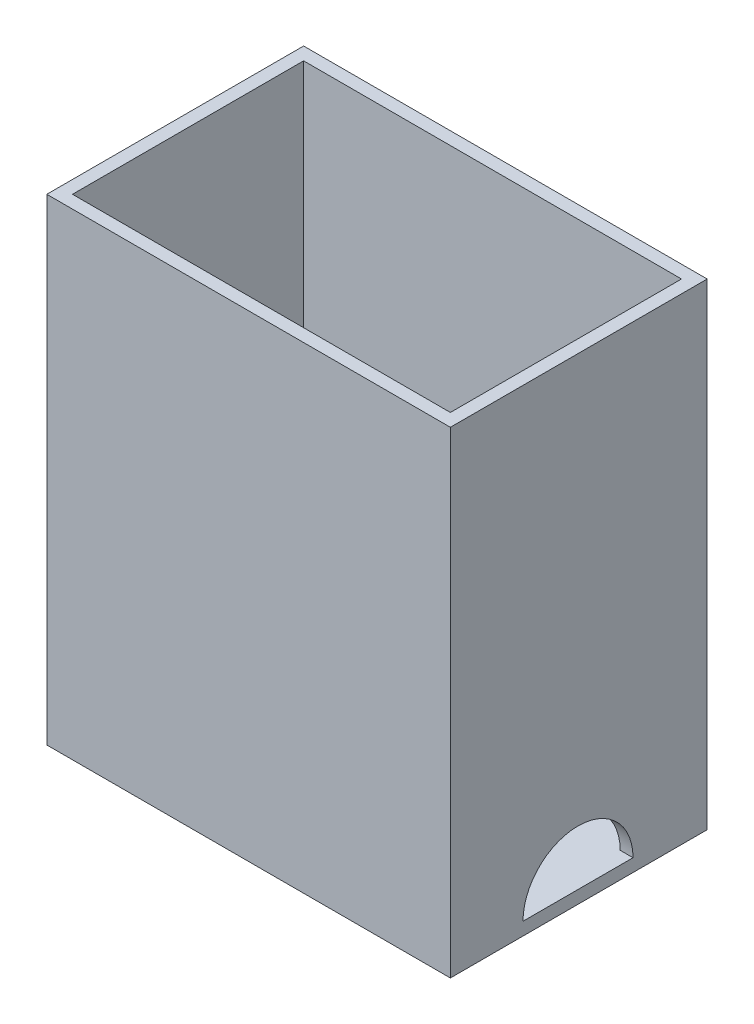
ISO-10303-21;
HEADER;
FILE_DESCRIPTION(('STEP AP214'),'2;1');
FILE_NAME('part.step','',(''),(''),'','','');
FILE_SCHEMA(('AUTOMOTIVE_DESIGN { 1 0 10303 214 1 1 1 1 }'));
ENDSEC;
DATA;
#1=APPLICATION_CONTEXT('core data for automotive mechanical design processes');
#2=APPLICATION_PROTOCOL_DEFINITION('international standard','automotive_design',2000,#1);
#3=PRODUCT_CONTEXT('',#1,'mechanical');
#4=PRODUCT('Part','Part','',(#3));
#5=PRODUCT_RELATED_PRODUCT_CATEGORY('part','',(#4));
#6=PRODUCT_DEFINITION_FORMATION('','',#4);
#7=PRODUCT_DEFINITION_CONTEXT('part definition',#1,'design');
#8=PRODUCT_DEFINITION('design','',#6,#7);
#9=PRODUCT_DEFINITION_SHAPE('','',#8);
#10=(LENGTH_UNIT() NAMED_UNIT(*) SI_UNIT(.MILLI.,.METRE.));
#11=(NAMED_UNIT(*) PLANE_ANGLE_UNIT() SI_UNIT($,.RADIAN.));
#12=(NAMED_UNIT(*) SI_UNIT($,.STERADIAN.) SOLID_ANGLE_UNIT());
#13=UNCERTAINTY_MEASURE_WITH_UNIT(LENGTH_MEASURE(1.E-05),#10,'distance_accuracy_value','');
#14=(GEOMETRIC_REPRESENTATION_CONTEXT(3) GLOBAL_UNCERTAINTY_ASSIGNED_CONTEXT((#13)) GLOBAL_UNIT_ASSIGNED_CONTEXT((#10,
#11,#12)) REPRESENTATION_CONTEXT('',''));
#15=CARTESIAN_POINT('',(0.,0.,0.));
#16=DIRECTION('',(0.,0.,1.));
#17=DIRECTION('',(1.,0.,0.));
#18=AXIS2_PLACEMENT_3D('',#15,#16,#17);
#19=CARTESIAN_POINT('',(-55.,130.,35.));
#20=DIRECTION('',(1.,0.,0.));
#21=DIRECTION('',(0.,0.,-1.));
#22=AXIS2_PLACEMENT_3D('',#19,#20,#21);
#23=PLANE('',#22);
#24=CARTESIAN_POINT('',(-55.,3.50000000000001,0.214471979984068));
#25=DIRECTION('',(1.,0.,0.));
#26=DIRECTION('',(0.,0.,1.));
#27=AXIS2_PLACEMENT_3D('',#24,#25,#26);
#28=CIRCLE('',#27,14.9982587365655);
#29=CARTESIAN_POINT('',(-55.,3.5,-14.7837867565815));
#30=VERTEX_POINT('',#29);
#31=CARTESIAN_POINT('',(-55.,3.5,15.2127307165496));
#32=VERTEX_POINT('',#31);
#33=EDGE_CURVE('E260',#30,#32,#28,.T.);
#34=ORIENTED_EDGE('',*,*,#33,.T.);
#35=DIRECTION('',(0.,0.,-1.));
#36=VECTOR('',#35,1.);
#37=CARTESIAN_POINT('',(-55.,3.5,15.2127307165496));
#38=LINE('',#37,#36);
#39=EDGE_CURVE('E50',#32,#30,#38,.T.);
#40=ORIENTED_EDGE('',*,*,#39,.T.);
#41=EDGE_LOOP('',(#34,#40));
#42=FACE_BOUND('',#41,.T.);
#43=DIRECTION('',(0.,0.,1.));
#44=VECTOR('',#43,1.);
#45=CARTESIAN_POINT('',(-55.,0.,35.));
#46=LINE('',#45,#44);
#47=CARTESIAN_POINT('',(-55.,0.,-35.));
#48=VERTEX_POINT('',#47);
#49=CARTESIAN_POINT('',(-55.,0.,35.));
#50=VERTEX_POINT('',#49);
#51=EDGE_CURVE('E181',#48,#50,#46,.T.);
#52=ORIENTED_EDGE('',*,*,#51,.T.);
#53=DIRECTION('',(0.,-1.,0.));
#54=VECTOR('',#53,1.);
#55=CARTESIAN_POINT('',(-55.,130.,35.));
#56=LINE('',#55,#54);
#57=CARTESIAN_POINT('',(-55.,130.,35.));
#58=VERTEX_POINT('',#57);
#59=EDGE_CURVE('E11',#58,#50,#56,.T.);
#60=ORIENTED_EDGE('',*,*,#59,.F.);
#61=DIRECTION('',(0.,0.,1.));
#62=VECTOR('',#61,1.);
#63=CARTESIAN_POINT('',(-55.,130.,35.));
#64=LINE('',#63,#62);
#65=CARTESIAN_POINT('',(-55.,130.,-35.));
#66=VERTEX_POINT('',#65);
#67=EDGE_CURVE('E170',#66,#58,#64,.T.);
#68=ORIENTED_EDGE('',*,*,#67,.F.);
#69=DIRECTION('',(0.,-1.,0.));
#70=VECTOR('',#69,1.);
#71=CARTESIAN_POINT('',(-55.,130.,-35.));
#72=LINE('',#71,#70);
#73=EDGE_CURVE('E180',#66,#48,#72,.T.);
#74=ORIENTED_EDGE('',*,*,#73,.T.);
#75=EDGE_LOOP('',(#52,#60,#68,#74));
#76=FACE_BOUND('',#75,.T.);
#77=ADVANCED_FACE('F33',(#42,#76),#23,.F.);
#78=CARTESIAN_POINT('',(55.,130.,35.));
#79=DIRECTION('',(0.,0.,-1.));
#80=DIRECTION('',(-1.,0.,0.));
#81=AXIS2_PLACEMENT_3D('',#78,#79,#80);
#82=PLANE('',#81);
#83=DIRECTION('',(1.,0.,0.));
#84=VECTOR('',#83,1.);
#85=CARTESIAN_POINT('',(55.,0.,35.));
#86=LINE('',#85,#84);
#87=CARTESIAN_POINT('',(55.,0.,35.));
#88=VERTEX_POINT('',#87);
#89=EDGE_CURVE('E184',#50,#88,#86,.T.);
#90=ORIENTED_EDGE('',*,*,#89,.T.);
#91=DIRECTION('',(0.,-1.,0.));
#92=VECTOR('',#91,1.);
#93=CARTESIAN_POINT('',(55.,130.,35.));
#94=LINE('',#93,#92);
#95=CARTESIAN_POINT('',(55.,130.,35.));
#96=VERTEX_POINT('',#95);
#97=EDGE_CURVE('E42',#96,#88,#94,.T.);
#98=ORIENTED_EDGE('',*,*,#97,.F.);
#99=DIRECTION('',(1.,0.,0.));
#100=VECTOR('',#99,1.);
#101=CARTESIAN_POINT('',(55.,130.,35.));
#102=LINE('',#101,#100);
#103=EDGE_CURVE('E173',#58,#96,#102,.T.);
#104=ORIENTED_EDGE('',*,*,#103,.F.);
#105=ORIENTED_EDGE('',*,*,#59,.T.);
#106=EDGE_LOOP('',(#90,#98,#104,#105));
#107=FACE_BOUND('',#106,.T.);
#108=ADVANCED_FACE('F251',(#107),#82,.F.);
#109=CARTESIAN_POINT('',(55.,130.,35.));
#110=DIRECTION('',(-1.,0.,0.));
#111=DIRECTION('',(0.,0.,1.));
#112=AXIS2_PLACEMENT_3D('',#109,#110,#111);
#113=PLANE('',#112);
#114=CARTESIAN_POINT('',(55.,3.50000000000001,0.214471979984076));
#115=DIRECTION('',(1.,0.,0.));
#116=DIRECTION('',(0.,0.,-1.));
#117=AXIS2_PLACEMENT_3D('',#114,#115,#116);
#118=CIRCLE('',#117,14.9982587365655);
#119=CARTESIAN_POINT('',(55.,3.5,-14.7837867565815));
#120=VERTEX_POINT('',#119);
#121=CARTESIAN_POINT('',(55.,3.5,15.2127307165496));
#122=VERTEX_POINT('',#121);
#123=EDGE_CURVE('E63',#120,#122,#118,.T.);
#124=ORIENTED_EDGE('',*,*,#123,.F.);
#125=DIRECTION('',(0.,0.,-1.));
#126=VECTOR('',#125,1.);
#127=CARTESIAN_POINT('',(55.,3.5,15.2127307165496));
#128=LINE('',#127,#126);
#129=EDGE_CURVE('E36',#122,#120,#128,.T.);
#130=ORIENTED_EDGE('',*,*,#129,.F.);
#131=EDGE_LOOP('',(#124,#130));
#132=FACE_BOUND('',#131,.T.);
#133=DIRECTION('',(0.,0.,-1.));
#134=VECTOR('',#133,1.);
#135=CARTESIAN_POINT('',(55.,0.,35.));
#136=LINE('',#135,#134);
#137=CARTESIAN_POINT('',(55.,0.,-35.));
#138=VERTEX_POINT('',#137);
#139=EDGE_CURVE('E187',#88,#138,#136,.T.);
#140=ORIENTED_EDGE('',*,*,#139,.T.);
#141=DIRECTION('',(0.,-1.,0.));
#142=VECTOR('',#141,1.);
#143=CARTESIAN_POINT('',(55.,130.,-35.));
#144=LINE('',#143,#142);
#145=CARTESIAN_POINT('',(55.,130.,-35.));
#146=VERTEX_POINT('',#145);
#147=EDGE_CURVE('E192',#146,#138,#144,.T.);
#148=ORIENTED_EDGE('',*,*,#147,.F.);
#149=DIRECTION('',(0.,0.,-1.));
#150=VECTOR('',#149,1.);
#151=CARTESIAN_POINT('',(55.,130.,35.));
#152=LINE('',#151,#150);
#153=EDGE_CURVE('E176',#96,#146,#152,.T.);
#154=ORIENTED_EDGE('',*,*,#153,.F.);
#155=ORIENTED_EDGE('',*,*,#97,.T.);
#156=EDGE_LOOP('',(#140,#148,#154,#155));
#157=FACE_BOUND('',#156,.T.);
#158=ADVANCED_FACE('F256',(#132,#157),#113,.F.);
#159=CARTESIAN_POINT('',(55.,130.,-35.));
#160=DIRECTION('',(0.,0.,1.));
#161=DIRECTION('',(1.,0.,0.));
#162=AXIS2_PLACEMENT_3D('',#159,#160,#161);
#163=PLANE('',#162);
#164=DIRECTION('',(-1.,0.,0.));
#165=VECTOR('',#164,1.);
#166=CARTESIAN_POINT('',(55.,0.,-35.));
#167=LINE('',#166,#165);
#168=EDGE_CURVE('E174',#138,#48,#167,.T.);
#169=ORIENTED_EDGE('',*,*,#168,.T.);
#170=ORIENTED_EDGE('',*,*,#73,.F.);
#171=DIRECTION('',(-1.,0.,0.));
#172=VECTOR('',#171,1.);
#173=CARTESIAN_POINT('',(55.,130.,-35.));
#174=LINE('',#173,#172);
#175=EDGE_CURVE('E178',#146,#66,#174,.T.);
#176=ORIENTED_EDGE('',*,*,#175,.F.);
#177=ORIENTED_EDGE('',*,*,#147,.T.);
#178=EDGE_LOOP('',(#169,#170,#176,#177));
#179=FACE_BOUND('',#178,.T.);
#180=ADVANCED_FACE('F273',(#179),#163,.F.);
#181=CARTESIAN_POINT('',(0.,130.,0.));
#182=DIRECTION('',(0.,1.,0.));
#183=DIRECTION('',(0.,0.,1.));
#184=AXIS2_PLACEMENT_3D('',#181,#182,#183);
#185=PLANE('',#184);
#186=DIRECTION('',(0.,0.,1.));
#187=VECTOR('',#186,1.);
#188=CARTESIAN_POINT('',(-51.5,130.,35.));
#189=LINE('',#188,#187);
#190=CARTESIAN_POINT('',(-51.5,130.,-31.5));
#191=VERTEX_POINT('',#190);
#192=CARTESIAN_POINT('',(-51.5,130.,31.5));
#193=VERTEX_POINT('',#192);
#194=EDGE_CURVE('E153',#191,#193,#189,.T.);
#195=ORIENTED_EDGE('',*,*,#194,.F.);
#196=DIRECTION('',(-1.,0.,0.));
#197=VECTOR('',#196,1.);
#198=CARTESIAN_POINT('',(55.,130.,-31.5));
#199=LINE('',#198,#197);
#200=CARTESIAN_POINT('',(51.5,130.,-31.5));
#201=VERTEX_POINT('',#200);
#202=EDGE_CURVE('E168',#201,#191,#199,.T.);
#203=ORIENTED_EDGE('',*,*,#202,.F.);
#204=DIRECTION('',(0.,0.,-1.));
#205=VECTOR('',#204,1.);
#206=CARTESIAN_POINT('',(51.5,130.,35.));
#207=LINE('',#206,#205);
#208=CARTESIAN_POINT('',(51.5,130.,31.5));
#209=VERTEX_POINT('',#208);
#210=EDGE_CURVE('E165',#209,#201,#207,.T.);
#211=ORIENTED_EDGE('',*,*,#210,.F.);
#212=DIRECTION('',(1.,0.,0.));
#213=VECTOR('',#212,1.);
#214=CARTESIAN_POINT('',(55.,130.,31.5));
#215=LINE('',#214,#213);
#216=EDGE_CURVE('E163',#193,#209,#215,.T.);
#217=ORIENTED_EDGE('',*,*,#216,.F.);
#218=EDGE_LOOP('',(#195,#203,#211,#217));
#219=FACE_BOUND('',#218,.T.);
#220=ORIENTED_EDGE('',*,*,#67,.T.);
#221=ORIENTED_EDGE('',*,*,#103,.T.);
#222=ORIENTED_EDGE('',*,*,#153,.T.);
#223=ORIENTED_EDGE('',*,*,#175,.T.);
#224=EDGE_LOOP('',(#220,#221,#222,#223));
#225=FACE_BOUND('',#224,.T.);
#226=ADVANCED_FACE('F236',(#219,#225),#185,.T.);
#227=CARTESIAN_POINT('',(0.,0.,0.));
#228=DIRECTION('',(0.,1.,0.));
#229=DIRECTION('',(0.,0.,1.));
#230=AXIS2_PLACEMENT_3D('',#227,#228,#229);
#231=PLANE('',#230);
#232=CARTESIAN_POINT('',(24.5,0.,0.));
#233=DIRECTION('',(0.,1.,0.));
#234=DIRECTION('',(0.,0.,1.));
#235=AXIS2_PLACEMENT_3D('',#232,#233,#234);
#236=CIRCLE('',#235,6.);
#237=CARTESIAN_POINT('',(24.5,0.,6.));
#238=VERTEX_POINT('',#237);
#239=EDGE_CURVE('E202',#238,#238,#236,.T.);
#240=ORIENTED_EDGE('',*,*,#239,.T.);
#241=EDGE_LOOP('',(#240));
#242=FACE_BOUND('',#241,.T.);
#243=CARTESIAN_POINT('',(0.,0.,0.));
#244=DIRECTION('',(0.,1.,0.));
#245=DIRECTION('',(0.,0.,1.));
#246=AXIS2_PLACEMENT_3D('',#243,#244,#245);
#247=CIRCLE('',#246,1.50000000000001);
#248=CARTESIAN_POINT('',(0.,0.,1.50000000000001));
#249=VERTEX_POINT('',#248);
#250=EDGE_CURVE('E196',#249,#249,#247,.T.);
#251=ORIENTED_EDGE('',*,*,#250,.T.);
#252=EDGE_LOOP('',(#251));
#253=FACE_BOUND('',#252,.T.);
#254=CARTESIAN_POINT('',(-24.5,0.,0.));
#255=DIRECTION('',(0.,1.,0.));
#256=DIRECTION('',(0.,0.,1.));
#257=AXIS2_PLACEMENT_3D('',#254,#255,#256);
#258=CIRCLE('',#257,6.);
#259=CARTESIAN_POINT('',(-24.5,0.,6.00000000000001));
#260=VERTEX_POINT('',#259);
#261=EDGE_CURVE('E207',#260,#260,#258,.T.);
#262=ORIENTED_EDGE('',*,*,#261,.T.);
#263=EDGE_LOOP('',(#262));
#264=FACE_BOUND('',#263,.T.);
#265=ORIENTED_EDGE('',*,*,#51,.F.);
#266=ORIENTED_EDGE('',*,*,#168,.F.);
#267=ORIENTED_EDGE('',*,*,#139,.F.);
#268=ORIENTED_EDGE('',*,*,#89,.F.);
#269=EDGE_LOOP('',(#265,#266,#267,#268));
#270=FACE_BOUND('',#269,.T.);
#271=ADVANCED_FACE('F248',(#242,#253,#264,#270),#231,.F.);
#272=CARTESIAN_POINT('',(-51.5,130.,35.));
#273=DIRECTION('',(1.,0.,0.));
#274=DIRECTION('',(0.,0.,-1.));
#275=AXIS2_PLACEMENT_3D('',#272,#273,#274);
#276=PLANE('',#275);
#277=CARTESIAN_POINT('',(-51.5,3.50000000000001,0.214471979984076));
#278=DIRECTION('',(1.,0.,0.));
#279=DIRECTION('',(0.,0.,-1.));
#280=AXIS2_PLACEMENT_3D('',#277,#278,#279);
#281=CIRCLE('',#280,14.9982587365655);
#282=CARTESIAN_POINT('',(-51.5,3.5,-14.7837867565815));
#283=VERTEX_POINT('',#282);
#284=CARTESIAN_POINT('',(-51.5,3.5,15.2127307165496));
#285=VERTEX_POINT('',#284);
#286=EDGE_CURVE('E74',#283,#285,#281,.T.);
#287=ORIENTED_EDGE('',*,*,#286,.F.);
#288=DIRECTION('',(0.,0.,1.));
#289=VECTOR('',#288,1.);
#290=CARTESIAN_POINT('',(-51.5,3.5,35.));
#291=LINE('',#290,#289);
#292=CARTESIAN_POINT('',(-51.5,3.5,-31.5));
#293=VERTEX_POINT('',#292);
#294=EDGE_CURVE('E217',#293,#283,#291,.T.);
#295=ORIENTED_EDGE('',*,*,#294,.F.);
#296=DIRECTION('',(0.,-1.,0.));
#297=VECTOR('',#296,1.);
#298=CARTESIAN_POINT('',(-51.5,130.,-31.5));
#299=LINE('',#298,#297);
#300=EDGE_CURVE('E160',#191,#293,#299,.T.);
#301=ORIENTED_EDGE('',*,*,#300,.F.);
#302=ORIENTED_EDGE('',*,*,#194,.T.);
#303=DIRECTION('',(0.,-1.,0.));
#304=VECTOR('',#303,1.);
#305=CARTESIAN_POINT('',(-51.5,130.,31.5));
#306=LINE('',#305,#304);
#307=CARTESIAN_POINT('',(-51.5,3.5,31.5));
#308=VERTEX_POINT('',#307);
#309=EDGE_CURVE('E185',#193,#308,#306,.T.);
#310=ORIENTED_EDGE('',*,*,#309,.T.);
#311=EDGE_CURVE('E216',#285,#308,#291,.T.);
#312=ORIENTED_EDGE('',*,*,#311,.F.);
#313=EDGE_LOOP('',(#287,#295,#301,#302,#310,#312));
#314=FACE_BOUND('',#313,.T.);
#315=ADVANCED_FACE('F230',(#314),#276,.T.);
#316=CARTESIAN_POINT('',(55.,130.,31.5));
#317=DIRECTION('',(0.,0.,-1.));
#318=DIRECTION('',(-1.,0.,0.));
#319=AXIS2_PLACEMENT_3D('',#316,#317,#318);
#320=PLANE('',#319);
#321=DIRECTION('',(1.,0.,0.));
#322=VECTOR('',#321,1.);
#323=CARTESIAN_POINT('',(55.,3.5,31.5));
#324=LINE('',#323,#322);
#325=CARTESIAN_POINT('',(51.5,3.5,31.5));
#326=VERTEX_POINT('',#325);
#327=EDGE_CURVE('E149',#308,#326,#324,.T.);
#328=ORIENTED_EDGE('',*,*,#327,.F.);
#329=ORIENTED_EDGE('',*,*,#309,.F.);
#330=ORIENTED_EDGE('',*,*,#216,.T.);
#331=DIRECTION('',(0.,-1.,0.));
#332=VECTOR('',#331,1.);
#333=CARTESIAN_POINT('',(51.5,130.,31.5));
#334=LINE('',#333,#332);
#335=EDGE_CURVE('E157',#209,#326,#334,.T.);
#336=ORIENTED_EDGE('',*,*,#335,.T.);
#337=EDGE_LOOP('',(#328,#329,#330,#336));
#338=FACE_BOUND('',#337,.T.);
#339=ADVANCED_FACE('F240',(#338),#320,.T.);
#340=CARTESIAN_POINT('',(51.5,130.,35.));
#341=DIRECTION('',(-1.,0.,0.));
#342=DIRECTION('',(0.,0.,1.));
#343=AXIS2_PLACEMENT_3D('',#340,#341,#342);
#344=PLANE('',#343);
#345=CARTESIAN_POINT('',(51.5,3.50000000000001,0.214471979984076));
#346=DIRECTION('',(-1.,0.,0.));
#347=DIRECTION('',(0.,0.,1.));
#348=AXIS2_PLACEMENT_3D('',#345,#346,#347);
#349=CIRCLE('',#348,14.9982587365655);
#350=CARTESIAN_POINT('',(51.5,3.5,15.2127307165496));
#351=VERTEX_POINT('',#350);
#352=CARTESIAN_POINT('',(51.5,3.5,-14.7837867565815));
#353=VERTEX_POINT('',#352);
#354=EDGE_CURVE('E129',#351,#353,#349,.T.);
#355=ORIENTED_EDGE('',*,*,#354,.F.);
#356=DIRECTION('',(0.,0.,-1.));
#357=VECTOR('',#356,1.);
#358=CARTESIAN_POINT('',(51.5,3.5,35.));
#359=LINE('',#358,#357);
#360=EDGE_CURVE('E141',#326,#351,#359,.T.);
#361=ORIENTED_EDGE('',*,*,#360,.F.);
#362=ORIENTED_EDGE('',*,*,#335,.F.);
#363=ORIENTED_EDGE('',*,*,#210,.T.);
#364=DIRECTION('',(0.,-1.,0.));
#365=VECTOR('',#364,1.);
#366=CARTESIAN_POINT('',(51.5,130.,-31.5));
#367=LINE('',#366,#365);
#368=CARTESIAN_POINT('',(51.5,3.5,-31.5));
#369=VERTEX_POINT('',#368);
#370=EDGE_CURVE('E159',#201,#369,#367,.T.);
#371=ORIENTED_EDGE('',*,*,#370,.T.);
#372=EDGE_CURVE('E143',#353,#369,#359,.T.);
#373=ORIENTED_EDGE('',*,*,#372,.F.);
#374=EDGE_LOOP('',(#355,#361,#362,#363,#371,#373));
#375=FACE_BOUND('',#374,.T.);
#376=ADVANCED_FACE('F139',(#375),#344,.T.);
#377=CARTESIAN_POINT('',(55.,130.,-31.5));
#378=DIRECTION('',(0.,0.,1.));
#379=DIRECTION('',(1.,0.,0.));
#380=AXIS2_PLACEMENT_3D('',#377,#378,#379);
#381=PLANE('',#380);
#382=DIRECTION('',(-1.,0.,0.));
#383=VECTOR('',#382,1.);
#384=CARTESIAN_POINT('',(55.,3.5,-31.5));
#385=LINE('',#384,#383);
#386=EDGE_CURVE('E151',#369,#293,#385,.T.);
#387=ORIENTED_EDGE('',*,*,#386,.F.);
#388=ORIENTED_EDGE('',*,*,#370,.F.);
#389=ORIENTED_EDGE('',*,*,#202,.T.);
#390=ORIENTED_EDGE('',*,*,#300,.T.);
#391=EDGE_LOOP('',(#387,#388,#389,#390));
#392=FACE_BOUND('',#391,.T.);
#393=ADVANCED_FACE('F226',(#392),#381,.T.);
#394=CARTESIAN_POINT('',(0.,3.5,0.));
#395=DIRECTION('',(0.,1.,0.));
#396=DIRECTION('',(0.,0.,1.));
#397=AXIS2_PLACEMENT_3D('',#394,#395,#396);
#398=PLANE('',#397);
#399=ORIENTED_EDGE('',*,*,#294,.T.);
#400=DIRECTION('',(1.,0.,0.));
#401=VECTOR('',#400,1.);
#402=CARTESIAN_POINT('',(-55.,3.5,-14.7837867565815));
#403=LINE('',#402,#401);
#404=EDGE_CURVE('E125',#30,#283,#403,.T.);
#405=ORIENTED_EDGE('',*,*,#404,.F.);
#406=ORIENTED_EDGE('',*,*,#39,.F.);
#407=DIRECTION('',(1.,0.,0.));
#408=VECTOR('',#407,1.);
#409=CARTESIAN_POINT('',(-55.,3.5,15.2127307165496));
#410=LINE('',#409,#408);
#411=EDGE_CURVE('E134',#32,#285,#410,.T.);
#412=ORIENTED_EDGE('',*,*,#411,.T.);
#413=ORIENTED_EDGE('',*,*,#311,.T.);
#414=ORIENTED_EDGE('',*,*,#327,.T.);
#415=ORIENTED_EDGE('',*,*,#360,.T.);
#416=EDGE_CURVE('E126',#351,#122,#410,.T.);
#417=ORIENTED_EDGE('',*,*,#416,.T.);
#418=ORIENTED_EDGE('',*,*,#129,.T.);
#419=EDGE_CURVE('E232',#353,#120,#403,.T.);
#420=ORIENTED_EDGE('',*,*,#419,.F.);
#421=ORIENTED_EDGE('',*,*,#372,.T.);
#422=ORIENTED_EDGE('',*,*,#386,.T.);
#423=EDGE_LOOP('',(#399,#405,#406,#412,#413,#414,#415,#417,#418,#420,#421,#422));
#424=FACE_BOUND('',#423,.T.);
#425=CARTESIAN_POINT('',(24.5,3.5,0.));
#426=DIRECTION('',(0.,1.,0.));
#427=DIRECTION('',(0.,0.,1.));
#428=AXIS2_PLACEMENT_3D('',#425,#426,#427);
#429=CIRCLE('',#428,6.);
#430=CARTESIAN_POINT('',(24.5,3.5,6.));
#431=VERTEX_POINT('',#430);
#432=EDGE_CURVE('E205',#431,#431,#429,.T.);
#433=ORIENTED_EDGE('',*,*,#432,.F.);
#434=EDGE_LOOP('',(#433));
#435=FACE_BOUND('',#434,.T.);
#436=CARTESIAN_POINT('',(0.,3.5,0.));
#437=DIRECTION('',(0.,1.,0.));
#438=DIRECTION('',(0.,0.,1.));
#439=AXIS2_PLACEMENT_3D('',#436,#437,#438);
#440=CIRCLE('',#439,1.50000000000001);
#441=CARTESIAN_POINT('',(0.,3.5,1.50000000000001));
#442=VERTEX_POINT('',#441);
#443=EDGE_CURVE('E198',#442,#442,#440,.T.);
#444=ORIENTED_EDGE('',*,*,#443,.F.);
#445=EDGE_LOOP('',(#444));
#446=FACE_BOUND('',#445,.T.);
#447=CARTESIAN_POINT('',(-24.5,3.5,0.));
#448=DIRECTION('',(0.,1.,0.));
#449=DIRECTION('',(0.,0.,1.));
#450=AXIS2_PLACEMENT_3D('',#447,#448,#449);
#451=CIRCLE('',#450,6.);
#452=CARTESIAN_POINT('',(-24.5,3.5,6.00000000000001));
#453=VERTEX_POINT('',#452);
#454=EDGE_CURVE('E213',#453,#453,#451,.T.);
#455=ORIENTED_EDGE('',*,*,#454,.F.);
#456=EDGE_LOOP('',(#455));
#457=FACE_BOUND('',#456,.T.);
#458=ADVANCED_FACE('F146',(#424,#435,#446,#457),#398,.T.);
#459=CARTESIAN_POINT('',(-24.5,130.001,0.));
#460=DIRECTION('',(0.,-1.,0.));
#461=DIRECTION('',(0.,0.,-1.));
#462=AXIS2_PLACEMENT_3D('',#459,#460,#461);
#463=CYLINDRICAL_SURFACE('',#462,6.);
#464=ORIENTED_EDGE('',*,*,#454,.T.);
#465=EDGE_LOOP('',(#464));
#466=FACE_BOUND('',#465,.T.);
#467=ORIENTED_EDGE('',*,*,#261,.F.);
#468=EDGE_LOOP('',(#467));
#469=FACE_BOUND('',#468,.T.);
#470=ADVANCED_FACE('F290',(#466,#469),#463,.F.);
#471=CARTESIAN_POINT('',(0.,130.001,0.));
#472=DIRECTION('',(0.,-1.,0.));
#473=DIRECTION('',(0.,0.,-1.));
#474=AXIS2_PLACEMENT_3D('',#471,#472,#473);
#475=CYLINDRICAL_SURFACE('',#474,1.50000000000001);
#476=ORIENTED_EDGE('',*,*,#443,.T.);
#477=EDGE_LOOP('',(#476));
#478=FACE_BOUND('',#477,.T.);
#479=ORIENTED_EDGE('',*,*,#250,.F.);
#480=EDGE_LOOP('',(#479));
#481=FACE_BOUND('',#480,.T.);
#482=ADVANCED_FACE('F308',(#478,#481),#475,.F.);
#483=CARTESIAN_POINT('',(24.5,130.001,0.));
#484=DIRECTION('',(0.,-1.,0.));
#485=DIRECTION('',(0.,0.,-1.));
#486=AXIS2_PLACEMENT_3D('',#483,#484,#485);
#487=CYLINDRICAL_SURFACE('',#486,6.);
#488=ORIENTED_EDGE('',*,*,#432,.T.);
#489=EDGE_LOOP('',(#488));
#490=FACE_BOUND('',#489,.T.);
#491=ORIENTED_EDGE('',*,*,#239,.F.);
#492=EDGE_LOOP('',(#491));
#493=FACE_BOUND('',#492,.T.);
#494=ADVANCED_FACE('F316',(#490,#493),#487,.F.);
#495=CARTESIAN_POINT('',(-55.,3.50000000000001,0.214471979984076));
#496=DIRECTION('',(1.,0.,0.));
#497=DIRECTION('',(0.,0.,-1.));
#498=AXIS2_PLACEMENT_3D('',#495,#496,#497);
#499=CYLINDRICAL_SURFACE('',#498,14.9982587365655);
#500=ORIENTED_EDGE('',*,*,#416,.F.);
#501=ORIENTED_EDGE('',*,*,#354,.T.);
#502=ORIENTED_EDGE('',*,*,#419,.T.);
#503=ORIENTED_EDGE('',*,*,#123,.T.);
#504=EDGE_LOOP('',(#500,#501,#502,#503));
#505=FACE_BOUND('',#504,.T.);
#506=ADVANCED_FACE('F128',(#505),#499,.F.);
#507=ORIENTED_EDGE('',*,*,#286,.T.);
#508=ORIENTED_EDGE('',*,*,#411,.F.);
#509=ORIENTED_EDGE('',*,*,#33,.F.);
#510=ORIENTED_EDGE('',*,*,#404,.T.);
#511=EDGE_LOOP('',(#507,#508,#509,#510));
#512=FACE_BOUND('',#511,.T.);
#513=ADVANCED_FACE('F330',(#512),#499,.F.);
#514=CLOSED_SHELL('',(#77,#108,#158,#180,#226,#271,#315,#339,#376,#393,#458,#470,#482,#494,#506,#513));
#515=MANIFOLD_SOLID_BREP('B2',#514);
#516=ADVANCED_BREP_SHAPE_REPRESENTATION('',(#18,#515),#14);
#517=SHAPE_DEFINITION_REPRESENTATION(#9,#516);
ENDSEC;
END-ISO-10303-21;
